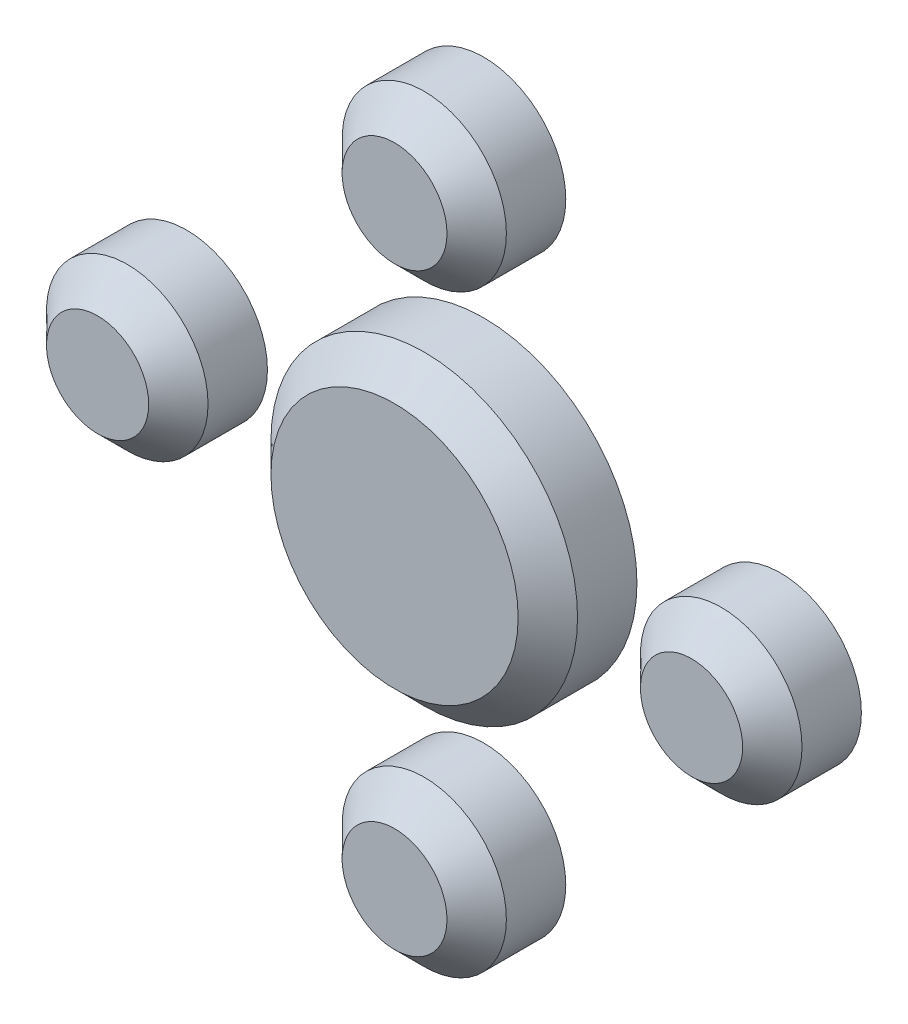
ISO-10303-21;
HEADER;
FILE_DESCRIPTION(('STEP AP214'),'2;1');
FILE_NAME('part.step','',(''),(''),'','','');
FILE_SCHEMA(('AUTOMOTIVE_DESIGN { 1 0 10303 214 1 1 1 1 }'));
ENDSEC;
DATA;
#1=APPLICATION_CONTEXT('core data for automotive mechanical design processes');
#2=APPLICATION_PROTOCOL_DEFINITION('international standard','automotive_design',2000,#1);
#3=PRODUCT_CONTEXT('',#1,'mechanical');
#4=PRODUCT('Part','Part','',(#3));
#5=PRODUCT_RELATED_PRODUCT_CATEGORY('part','',(#4));
#6=PRODUCT_DEFINITION_FORMATION('','',#4);
#7=PRODUCT_DEFINITION_CONTEXT('part definition',#1,'design');
#8=PRODUCT_DEFINITION('design','',#6,#7);
#9=PRODUCT_DEFINITION_SHAPE('','',#8);
#10=(LENGTH_UNIT() NAMED_UNIT(*) SI_UNIT(.MILLI.,.METRE.));
#11=(NAMED_UNIT(*) PLANE_ANGLE_UNIT() SI_UNIT($,.RADIAN.));
#12=(NAMED_UNIT(*) SI_UNIT($,.STERADIAN.) SOLID_ANGLE_UNIT());
#13=UNCERTAINTY_MEASURE_WITH_UNIT(LENGTH_MEASURE(1.E-05),#10,'distance_accuracy_value','');
#14=(GEOMETRIC_REPRESENTATION_CONTEXT(3) GLOBAL_UNCERTAINTY_ASSIGNED_CONTEXT((#13)) GLOBAL_UNIT_ASSIGNED_CONTEXT((#10,
#11,#12)) REPRESENTATION_CONTEXT('',''));
#15=CARTESIAN_POINT('',(0.,0.,0.));
#16=DIRECTION('',(0.,0.,1.));
#17=DIRECTION('',(1.,0.,0.));
#18=AXIS2_PLACEMENT_3D('',#15,#16,#17);
#19=CARTESIAN_POINT('',(0.,0.,3.));
#20=DIRECTION('',(0.,0.,-1.));
#21=DIRECTION('',(-1.,0.,0.));
#22=AXIS2_PLACEMENT_3D('',#19,#20,#21);
#23=CYLINDRICAL_SURFACE('',#22,5.16202871793152);
#24=CARTESIAN_POINT('',(0.,0.,1.99999999999999));
#25=DIRECTION('',(0.,0.,1.));
#26=DIRECTION('',(1.,0.,0.));
#27=AXIS2_PLACEMENT_3D('',#24,#25,#26);
#28=CIRCLE('',#27,5.16202871793152);
#29=CARTESIAN_POINT('',(5.16202871793152,0.,1.99999999999999));
#30=VERTEX_POINT('',#29);
#31=EDGE_CURVE('E11',#30,#30,#28,.F.);
#32=ORIENTED_EDGE('',*,*,#31,.T.);
#33=EDGE_LOOP('',(#32));
#34=FACE_BOUND('',#33,.T.);
#35=CARTESIAN_POINT('',(0.,0.,0.));
#36=DIRECTION('',(0.,0.,1.));
#37=DIRECTION('',(1.,0.,0.));
#38=AXIS2_PLACEMENT_3D('',#35,#36,#37);
#39=CIRCLE('',#38,5.16202871793152);
#40=CARTESIAN_POINT('',(5.16202871793152,0.,0.));
#41=VERTEX_POINT('',#40);
#42=EDGE_CURVE('E58',#41,#41,#39,.T.);
#43=ORIENTED_EDGE('',*,*,#42,.T.);
#44=EDGE_LOOP('',(#43));
#45=FACE_BOUND('',#44,.T.);
#46=ADVANCED_FACE('F48',(#34,#45),#23,.T.);
#47=CARTESIAN_POINT('',(0.,0.,3.));
#48=DIRECTION('',(0.,0.,1.));
#49=DIRECTION('',(1.,0.,0.));
#50=AXIS2_PLACEMENT_3D('',#47,#48,#49);
#51=PLANE('',#50);
#52=CARTESIAN_POINT('',(0.,0.,3.));
#53=DIRECTION('',(0.,0.,1.));
#54=DIRECTION('',(1.,0.,0.));
#55=AXIS2_PLACEMENT_3D('',#52,#53,#54);
#56=CIRCLE('',#55,4.16202871793152);
#57=CARTESIAN_POINT('',(4.16202871793152,0.,3.));
#58=VERTEX_POINT('',#57);
#59=EDGE_CURVE('E57',#58,#58,#56,.T.);
#60=ORIENTED_EDGE('',*,*,#59,.T.);
#61=EDGE_LOOP('',(#60));
#62=FACE_BOUND('',#61,.T.);
#63=ADVANCED_FACE('F67',(#62),#51,.T.);
#64=CARTESIAN_POINT('',(0.,0.,0.));
#65=DIRECTION('',(0.,0.,1.));
#66=DIRECTION('',(1.,0.,0.));
#67=AXIS2_PLACEMENT_3D('',#64,#65,#66);
#68=PLANE('',#67);
#69=ORIENTED_EDGE('',*,*,#42,.F.);
#70=EDGE_LOOP('',(#69));
#71=FACE_BOUND('',#70,.T.);
#72=ADVANCED_FACE('F70',(#71),#68,.F.);
#73=CARTESIAN_POINT('',(0.,0.,3.));
#74=DIRECTION('',(0.,0.,-1.));
#75=DIRECTION('',(-1.,0.,0.));
#76=AXIS2_PLACEMENT_3D('',#73,#74,#75);
#77=CONICAL_SURFACE('',#76,4.16202871793152,0.785398163397445);
#78=ORIENTED_EDGE('',*,*,#31,.F.);
#79=EDGE_LOOP('',(#78));
#80=FACE_BOUND('',#79,.T.);
#81=ORIENTED_EDGE('',*,*,#59,.F.);
#82=EDGE_LOOP('',(#81));
#83=FACE_BOUND('',#82,.T.);
#84=ADVANCED_FACE('F51',(#80,#83),#77,.T.);
#85=CLOSED_SHELL('',(#46,#63,#72,#84));
#86=MANIFOLD_SOLID_BREP('B2',#85);
#87=CARTESIAN_POINT('',(10.,0.,3.));
#88=DIRECTION('',(0.,0.,-1.));
#89=DIRECTION('',(-1.,0.,0.));
#90=AXIS2_PLACEMENT_3D('',#87,#88,#89);
#91=CYLINDRICAL_SURFACE('',#90,2.71993083145123);
#92=CARTESIAN_POINT('',(10.,0.,2.));
#93=DIRECTION('',(0.,0.,1.));
#94=DIRECTION('',(1.,0.,0.));
#95=AXIS2_PLACEMENT_3D('',#92,#93,#94);
#96=CIRCLE('',#95,2.71993083145123);
#97=CARTESIAN_POINT('',(12.7199308314512,0.,2.));
#98=VERTEX_POINT('',#97);
#99=EDGE_CURVE('E125',#98,#98,#96,.F.);
#100=ORIENTED_EDGE('',*,*,#99,.T.);
#101=EDGE_LOOP('',(#100));
#102=FACE_BOUND('',#101,.T.);
#103=CARTESIAN_POINT('',(10.,0.,0.));
#104=DIRECTION('',(0.,0.,1.));
#105=DIRECTION('',(1.,0.,0.));
#106=AXIS2_PLACEMENT_3D('',#103,#104,#105);
#107=CIRCLE('',#106,2.71993083145123);
#108=CARTESIAN_POINT('',(12.7199308314512,0.,0.));
#109=VERTEX_POINT('',#108);
#110=EDGE_CURVE('E130',#109,#109,#107,.F.);
#111=ORIENTED_EDGE('',*,*,#110,.F.);
#112=EDGE_LOOP('',(#111));
#113=FACE_BOUND('',#112,.T.);
#114=ADVANCED_FACE('F113',(#102,#113),#91,.T.);
#115=CARTESIAN_POINT('',(0.,0.,3.));
#116=DIRECTION('',(0.,0.,1.));
#117=DIRECTION('',(1.,0.,0.));
#118=AXIS2_PLACEMENT_3D('',#115,#116,#117);
#119=PLANE('',#118);
#120=CARTESIAN_POINT('',(10.,0.,3.));
#121=DIRECTION('',(0.,0.,1.));
#122=DIRECTION('',(1.,0.,0.));
#123=AXIS2_PLACEMENT_3D('',#120,#121,#122);
#124=CIRCLE('',#123,1.71993083145123);
#125=CARTESIAN_POINT('',(11.7199308314512,0.,3.));
#126=VERTEX_POINT('',#125);
#127=EDGE_CURVE('E50',#126,#126,#124,.T.);
#128=ORIENTED_EDGE('',*,*,#127,.T.);
#129=EDGE_LOOP('',(#128));
#130=FACE_BOUND('',#129,.T.);
#131=ADVANCED_FACE('F136',(#130),#119,.T.);
#132=CARTESIAN_POINT('',(0.,0.,0.));
#133=DIRECTION('',(0.,0.,1.));
#134=DIRECTION('',(1.,0.,0.));
#135=AXIS2_PLACEMENT_3D('',#132,#133,#134);
#136=PLANE('',#135);
#137=ORIENTED_EDGE('',*,*,#110,.T.);
#138=EDGE_LOOP('',(#137));
#139=FACE_BOUND('',#138,.T.);
#140=ADVANCED_FACE('F133',(#139),#136,.F.);
#141=CARTESIAN_POINT('',(10.,0.,2.));
#142=DIRECTION('',(0.,0.,-1.));
#143=DIRECTION('',(-1.,0.,0.));
#144=AXIS2_PLACEMENT_3D('',#141,#142,#143);
#145=CONICAL_SURFACE('',#144,2.71993083145123,0.785398163397451);
#146=ORIENTED_EDGE('',*,*,#127,.F.);
#147=EDGE_LOOP('',(#146));
#148=FACE_BOUND('',#147,.T.);
#149=ORIENTED_EDGE('',*,*,#99,.F.);
#150=EDGE_LOOP('',(#149));
#151=FACE_BOUND('',#150,.T.);
#152=ADVANCED_FACE('F119',(#148,#151),#145,.T.);
#153=CLOSED_SHELL('',(#114,#131,#140,#152));
#154=MANIFOLD_SOLID_BREP('B6',#153);
#155=CARTESIAN_POINT('',(0.,-10.,3.));
#156=DIRECTION('',(0.,0.,-1.));
#157=DIRECTION('',(-1.,0.,0.));
#158=AXIS2_PLACEMENT_3D('',#155,#156,#157);
#159=CYLINDRICAL_SURFACE('',#158,2.76542389668583);
#160=CARTESIAN_POINT('',(0.,-10.,2.));
#161=DIRECTION('',(0.,0.,1.));
#162=DIRECTION('',(1.,0.,0.));
#163=AXIS2_PLACEMENT_3D('',#160,#161,#162);
#164=CIRCLE('',#163,2.76542389668583);
#165=CARTESIAN_POINT('',(2.76542389668583,-10.,2.));
#166=VERTEX_POINT('',#165);
#167=EDGE_CURVE('E190',#166,#166,#164,.F.);
#168=ORIENTED_EDGE('',*,*,#167,.T.);
#169=EDGE_LOOP('',(#168));
#170=FACE_BOUND('',#169,.T.);
#171=CARTESIAN_POINT('',(0.,-10.,0.));
#172=DIRECTION('',(0.,0.,1.));
#173=DIRECTION('',(1.,0.,0.));
#174=AXIS2_PLACEMENT_3D('',#171,#172,#173);
#175=CIRCLE('',#174,2.76542389668583);
#176=CARTESIAN_POINT('',(2.76542389668583,-10.,0.));
#177=VERTEX_POINT('',#176);
#178=EDGE_CURVE('E193',#177,#177,#175,.F.);
#179=ORIENTED_EDGE('',*,*,#178,.F.);
#180=EDGE_LOOP('',(#179));
#181=FACE_BOUND('',#180,.T.);
#182=ADVANCED_FACE('F185',(#170,#181),#159,.T.);
#183=CARTESIAN_POINT('',(0.,0.,3.));
#184=DIRECTION('',(0.,0.,1.));
#185=DIRECTION('',(1.,0.,0.));
#186=AXIS2_PLACEMENT_3D('',#183,#184,#185);
#187=PLANE('',#186);
#188=CARTESIAN_POINT('',(0.,-10.,3.));
#189=DIRECTION('',(0.,0.,1.));
#190=DIRECTION('',(1.,0.,0.));
#191=AXIS2_PLACEMENT_3D('',#188,#189,#190);
#192=CIRCLE('',#191,1.76542389668583);
#193=CARTESIAN_POINT('',(1.76542389668583,-10.,3.));
#194=VERTEX_POINT('',#193);
#195=EDGE_CURVE('E111',#194,#194,#192,.T.);
#196=ORIENTED_EDGE('',*,*,#195,.T.);
#197=EDGE_LOOP('',(#196));
#198=FACE_BOUND('',#197,.T.);
#199=ADVANCED_FACE('F204',(#198),#187,.T.);
#200=CARTESIAN_POINT('',(0.,0.,0.));
#201=DIRECTION('',(0.,0.,1.));
#202=DIRECTION('',(1.,0.,0.));
#203=AXIS2_PLACEMENT_3D('',#200,#201,#202);
#204=PLANE('',#203);
#205=ORIENTED_EDGE('',*,*,#178,.T.);
#206=EDGE_LOOP('',(#205));
#207=FACE_BOUND('',#206,.T.);
#208=ADVANCED_FACE('F203',(#207),#204,.F.);
#209=CARTESIAN_POINT('',(0.,-10.,2.));
#210=DIRECTION('',(0.,0.,-1.));
#211=DIRECTION('',(-1.,0.,0.));
#212=AXIS2_PLACEMENT_3D('',#209,#210,#211);
#213=CONICAL_SURFACE('',#212,2.76542389668583,0.78539816339745);
#214=ORIENTED_EDGE('',*,*,#195,.F.);
#215=EDGE_LOOP('',(#214));
#216=FACE_BOUND('',#215,.T.);
#217=ORIENTED_EDGE('',*,*,#167,.F.);
#218=EDGE_LOOP('',(#217));
#219=FACE_BOUND('',#218,.T.);
#220=ADVANCED_FACE('F183',(#216,#219),#213,.T.);
#221=CLOSED_SHELL('',(#182,#199,#208,#220));
#222=MANIFOLD_SOLID_BREP('B45',#221);
#223=CARTESIAN_POINT('',(-10.,0.,3.));
#224=DIRECTION('',(0.,0.,-1.));
#225=DIRECTION('',(-1.,0.,0.));
#226=AXIS2_PLACEMENT_3D('',#223,#224,#225);
#227=CYLINDRICAL_SURFACE('',#226,2.71993083145123);
#228=CARTESIAN_POINT('',(-10.,0.,2.));
#229=DIRECTION('',(0.,0.,1.));
#230=DIRECTION('',(1.,0.,0.));
#231=AXIS2_PLACEMENT_3D('',#228,#229,#230);
#232=CIRCLE('',#231,2.71993083145123);
#233=CARTESIAN_POINT('',(-7.28006916854877,0.,2.));
#234=VERTEX_POINT('',#233);
#235=EDGE_CURVE('E182',#234,#234,#232,.F.);
#236=ORIENTED_EDGE('',*,*,#235,.T.);
#237=EDGE_LOOP('',(#236));
#238=FACE_BOUND('',#237,.T.);
#239=CARTESIAN_POINT('',(-10.,0.,0.));
#240=DIRECTION('',(0.,0.,1.));
#241=DIRECTION('',(1.,0.,0.));
#242=AXIS2_PLACEMENT_3D('',#239,#240,#241);
#243=CIRCLE('',#242,2.71993083145123);
#244=CARTESIAN_POINT('',(-7.28006916854877,0.,0.));
#245=VERTEX_POINT('',#244);
#246=EDGE_CURVE('E257',#245,#245,#243,.T.);
#247=ORIENTED_EDGE('',*,*,#246,.T.);
#248=EDGE_LOOP('',(#247));
#249=FACE_BOUND('',#248,.T.);
#250=ADVANCED_FACE('F250',(#238,#249),#227,.T.);
#251=CARTESIAN_POINT('',(0.,0.,3.));
#252=DIRECTION('',(0.,0.,1.));
#253=DIRECTION('',(1.,0.,0.));
#254=AXIS2_PLACEMENT_3D('',#251,#252,#253);
#255=PLANE('',#254);
#256=CARTESIAN_POINT('',(-10.,0.,3.));
#257=DIRECTION('',(0.,0.,1.));
#258=DIRECTION('',(1.,0.,0.));
#259=AXIS2_PLACEMENT_3D('',#256,#257,#258);
#260=CIRCLE('',#259,1.71993083145123);
#261=CARTESIAN_POINT('',(-8.28006916854877,0.,3.));
#262=VERTEX_POINT('',#261);
#263=EDGE_CURVE('E258',#262,#262,#260,.T.);
#264=ORIENTED_EDGE('',*,*,#263,.T.);
#265=EDGE_LOOP('',(#264));
#266=FACE_BOUND('',#265,.T.);
#267=ADVANCED_FACE('F269',(#266),#255,.T.);
#268=CARTESIAN_POINT('',(0.,0.,0.));
#269=DIRECTION('',(0.,0.,1.));
#270=DIRECTION('',(1.,0.,0.));
#271=AXIS2_PLACEMENT_3D('',#268,#269,#270);
#272=PLANE('',#271);
#273=ORIENTED_EDGE('',*,*,#246,.F.);
#274=EDGE_LOOP('',(#273));
#275=FACE_BOUND('',#274,.T.);
#276=ADVANCED_FACE('F268',(#275),#272,.F.);
#277=CARTESIAN_POINT('',(-10.,0.,3.));
#278=DIRECTION('',(0.,0.,-1.));
#279=DIRECTION('',(-1.,0.,0.));
#280=AXIS2_PLACEMENT_3D('',#277,#278,#279);
#281=CONICAL_SURFACE('',#280,1.71993083145123,0.785398163397446);
#282=ORIENTED_EDGE('',*,*,#235,.F.);
#283=EDGE_LOOP('',(#282));
#284=FACE_BOUND('',#283,.T.);
#285=ORIENTED_EDGE('',*,*,#263,.F.);
#286=EDGE_LOOP('',(#285));
#287=FACE_BOUND('',#286,.T.);
#288=ADVANCED_FACE('F253',(#284,#287),#281,.T.);
#289=CLOSED_SHELL('',(#250,#267,#276,#288));
#290=MANIFOLD_SOLID_BREP('B108',#289);
#291=CARTESIAN_POINT('',(0.,10.,3.));
#292=DIRECTION('',(0.,0.,-1.));
#293=DIRECTION('',(-1.,0.,0.));
#294=AXIS2_PLACEMENT_3D('',#291,#292,#293);
#295=CYLINDRICAL_SURFACE('',#294,2.76542389668583);
#296=CARTESIAN_POINT('',(0.,10.,2.));
#297=DIRECTION('',(0.,0.,1.));
#298=DIRECTION('',(1.,0.,0.));
#299=AXIS2_PLACEMENT_3D('',#296,#297,#298);
#300=CIRCLE('',#299,2.76542389668583);
#301=CARTESIAN_POINT('',(2.76542389668583,10.,2.));
#302=VERTEX_POINT('',#301);
#303=EDGE_CURVE('E246',#302,#302,#300,.F.);
#304=ORIENTED_EDGE('',*,*,#303,.T.);
#305=EDGE_LOOP('',(#304));
#306=FACE_BOUND('',#305,.T.);
#307=CARTESIAN_POINT('',(0.,10.,0.));
#308=DIRECTION('',(0.,0.,1.));
#309=DIRECTION('',(1.,0.,0.));
#310=AXIS2_PLACEMENT_3D('',#307,#308,#309);
#311=CIRCLE('',#310,2.76542389668583);
#312=CARTESIAN_POINT('',(2.76542389668583,10.,0.));
#313=VERTEX_POINT('',#312);
#314=EDGE_CURVE('E317',#313,#313,#311,.T.);
#315=ORIENTED_EDGE('',*,*,#314,.T.);
#316=EDGE_LOOP('',(#315));
#317=FACE_BOUND('',#316,.T.);
#318=ADVANCED_FACE('F307',(#306,#317),#295,.T.);
#319=CARTESIAN_POINT('',(0.,0.,3.));
#320=DIRECTION('',(0.,0.,1.));
#321=DIRECTION('',(1.,0.,0.));
#322=AXIS2_PLACEMENT_3D('',#319,#320,#321);
#323=PLANE('',#322);
#324=CARTESIAN_POINT('',(0.,10.,3.));
#325=DIRECTION('',(0.,0.,1.));
#326=DIRECTION('',(1.,0.,0.));
#327=AXIS2_PLACEMENT_3D('',#324,#325,#326);
#328=CIRCLE('',#327,1.76542389668582);
#329=CARTESIAN_POINT('',(1.76542389668582,10.,3.));
#330=VERTEX_POINT('',#329);
#331=EDGE_CURVE('E312',#330,#330,#328,.T.);
#332=ORIENTED_EDGE('',*,*,#331,.T.);
#333=EDGE_LOOP('',(#332));
#334=FACE_BOUND('',#333,.T.);
#335=ADVANCED_FACE('F328',(#334),#323,.T.);
#336=CARTESIAN_POINT('',(0.,0.,0.));
#337=DIRECTION('',(0.,0.,1.));
#338=DIRECTION('',(1.,0.,0.));
#339=AXIS2_PLACEMENT_3D('',#336,#337,#338);
#340=PLANE('',#339);
#341=ORIENTED_EDGE('',*,*,#314,.F.);
#342=EDGE_LOOP('',(#341));
#343=FACE_BOUND('',#342,.T.);
#344=ADVANCED_FACE('F330',(#343),#340,.F.);
#345=CARTESIAN_POINT('',(0.,10.,3.));
#346=DIRECTION('',(0.,0.,-1.));
#347=DIRECTION('',(-1.,0.,0.));
#348=AXIS2_PLACEMENT_3D('',#345,#346,#347);
#349=CONICAL_SURFACE('',#348,1.76542389668582,0.785398163397447);
#350=ORIENTED_EDGE('',*,*,#303,.F.);
#351=EDGE_LOOP('',(#350));
#352=FACE_BOUND('',#351,.T.);
#353=ORIENTED_EDGE('',*,*,#331,.F.);
#354=EDGE_LOOP('',(#353));
#355=FACE_BOUND('',#354,.T.);
#356=ADVANCED_FACE('F309',(#352,#355),#349,.T.);
#357=CLOSED_SHELL('',(#318,#335,#344,#356));
#358=MANIFOLD_SOLID_BREP('B179',#357);
#359=ADVANCED_BREP_SHAPE_REPRESENTATION('',(#18,#86,#154,#222,#290,#358),#14);
#360=SHAPE_DEFINITION_REPRESENTATION(#9,#359);
ENDSEC;
END-ISO-10303-21;
